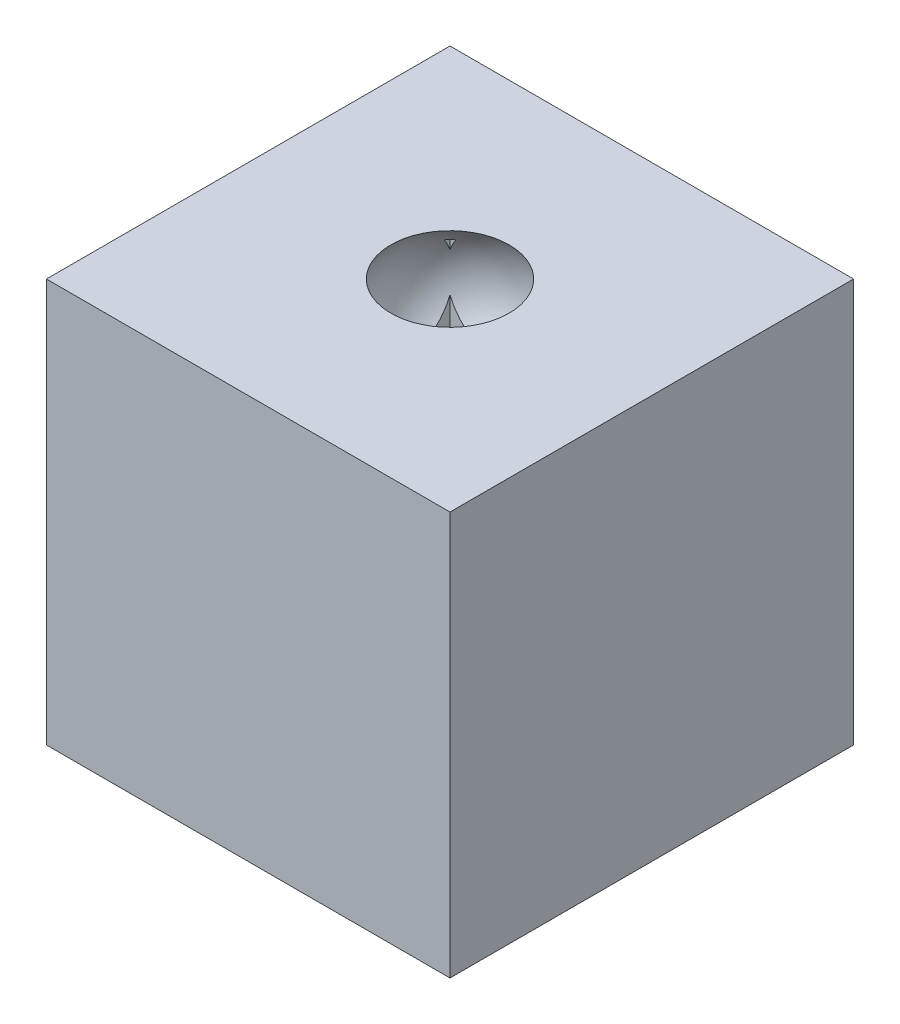
ISO-10303-21;
HEADER;
FILE_DESCRIPTION(('STEP AP214'),'2;1');
FILE_NAME('part.step','',(''),(''),'','','');
FILE_SCHEMA(('AUTOMOTIVE_DESIGN { 1 0 10303 214 1 1 1 1 }'));
ENDSEC;
DATA;
#1=APPLICATION_CONTEXT('core data for automotive mechanical design processes');
#2=APPLICATION_PROTOCOL_DEFINITION('international standard','automotive_design',2000,#1);
#3=PRODUCT_CONTEXT('',#1,'mechanical');
#4=PRODUCT('Part','Part','',(#3));
#5=PRODUCT_RELATED_PRODUCT_CATEGORY('part','',(#4));
#6=PRODUCT_DEFINITION_FORMATION('','',#4);
#7=PRODUCT_DEFINITION_CONTEXT('part definition',#1,'design');
#8=PRODUCT_DEFINITION('design','',#6,#7);
#9=PRODUCT_DEFINITION_SHAPE('','',#8);
#10=(LENGTH_UNIT() NAMED_UNIT(*) SI_UNIT(.MILLI.,.METRE.));
#11=(NAMED_UNIT(*) PLANE_ANGLE_UNIT() SI_UNIT($,.RADIAN.));
#12=(NAMED_UNIT(*) SI_UNIT($,.STERADIAN.) SOLID_ANGLE_UNIT());
#13=UNCERTAINTY_MEASURE_WITH_UNIT(LENGTH_MEASURE(1.E-05),#10,'distance_accuracy_value','');
#14=(GEOMETRIC_REPRESENTATION_CONTEXT(3) GLOBAL_UNCERTAINTY_ASSIGNED_CONTEXT((#13)) GLOBAL_UNIT_ASSIGNED_CONTEXT((#10,
#11,#12)) REPRESENTATION_CONTEXT('',''));
#15=CARTESIAN_POINT('',(0.,0.,0.));
#16=DIRECTION('',(0.,0.,1.));
#17=DIRECTION('',(1.,0.,0.));
#18=AXIS2_PLACEMENT_3D('',#15,#16,#17);
#19=CARTESIAN_POINT('',(0.,67.818,0.));
#20=DIRECTION('',(0.,-1.,0.));
#21=DIRECTION('',(-1.,0.,0.));
#22=AXIS2_PLACEMENT_3D('',#19,#20,#21);
#23=SPHERICAL_SURFACE('',#22,13.97);
#24=CARTESIAN_POINT('',(-9.525,67.818,0.));
#25=DIRECTION('',(1.,0.,0.));
#26=DIRECTION('',(0.,0.,-1.));
#27=AXIS2_PLACEMENT_3D('',#24,#25,#26);
#28=CIRCLE('',#27,10.2193578565387);
#29=CARTESIAN_POINT('',(-9.525,73.66,-8.38488586684399));
#30=VERTEX_POINT('',#29);
#31=CARTESIAN_POINT('',(-9.525,71.5206544532268,-9.525));
#32=VERTEX_POINT('',#31);
#33=EDGE_CURVE('E288',#30,#32,#28,.F.);
#34=ORIENTED_EDGE('',*,*,#33,.F.);
#35=CARTESIAN_POINT('',(0.,73.66,0.));
#36=DIRECTION('',(0.,-1.,0.));
#37=DIRECTION('',(0.,0.,-1.));
#38=AXIS2_PLACEMENT_3D('',#35,#36,#37);
#39=CIRCLE('',#38,12.6898359327455);
#40=CARTESIAN_POINT('',(-8.38488586684399,73.66,-9.525));
#41=VERTEX_POINT('',#40);
#42=EDGE_CURVE('E11',#41,#30,#39,.F.);
#43=ORIENTED_EDGE('',*,*,#42,.F.);
#44=CARTESIAN_POINT('',(0.,67.818,-9.525));
#45=DIRECTION('',(0.,0.,1.));
#46=DIRECTION('',(1.,0.,0.));
#47=AXIS2_PLACEMENT_3D('',#44,#45,#46);
#48=CIRCLE('',#47,10.2193578565387);
#49=EDGE_CURVE('E286',#32,#41,#48,.F.);
#50=ORIENTED_EDGE('',*,*,#49,.F.);
#51=EDGE_LOOP('',(#34,#43,#50));
#52=FACE_BOUND('',#51,.T.);
#53=CARTESIAN_POINT('',(0.,67.818,9.525));
#54=DIRECTION('',(0.,0.,-1.));
#55=DIRECTION('',(-1.,0.,0.));
#56=AXIS2_PLACEMENT_3D('',#53,#54,#55);
#57=CIRCLE('',#56,10.2193578565387);
#58=CARTESIAN_POINT('',(9.525,71.5206544532268,9.525));
#59=VERTEX_POINT('',#58);
#60=CARTESIAN_POINT('',(8.38488586684399,73.66,9.525));
#61=VERTEX_POINT('',#60);
#62=EDGE_CURVE('E292',#59,#61,#57,.F.);
#63=ORIENTED_EDGE('',*,*,#62,.F.);
#64=CARTESIAN_POINT('',(9.525,67.818,0.));
#65=DIRECTION('',(-1.,0.,0.));
#66=DIRECTION('',(0.,0.,1.));
#67=AXIS2_PLACEMENT_3D('',#64,#65,#66);
#68=CIRCLE('',#67,10.2193578565387);
#69=CARTESIAN_POINT('',(9.525,73.66,8.38488586684398));
#70=VERTEX_POINT('',#69);
#71=EDGE_CURVE('E279',#70,#59,#68,.F.);
#72=ORIENTED_EDGE('',*,*,#71,.F.);
#73=EDGE_CURVE('E466',#61,#70,#39,.F.);
#74=ORIENTED_EDGE('',*,*,#73,.F.);
#75=EDGE_LOOP('',(#63,#72,#74));
#76=FACE_BOUND('',#75,.T.);
#77=CARTESIAN_POINT('',(0.,76.2,0.));
#78=DIRECTION('',(0.,-1.,0.));
#79=DIRECTION('',(0.,0.,-1.));
#80=AXIS2_PLACEMENT_3D('',#77,#78,#79);
#81=CIRCLE('',#80,11.176);
#82=CARTESIAN_POINT('',(0.,76.2,-11.176));
#83=VERTEX_POINT('',#82);
#84=EDGE_CURVE('E412',#83,#83,#81,.T.);
#85=ORIENTED_EDGE('',*,*,#84,.F.);
#86=EDGE_LOOP('',(#85));
#87=FACE_BOUND('',#86,.T.);
#88=CARTESIAN_POINT('',(8.38488586684399,73.66,-9.525));
#89=VERTEX_POINT('',#88);
#90=CARTESIAN_POINT('',(9.525,71.5206544532268,-9.525));
#91=VERTEX_POINT('',#90);
#92=EDGE_CURVE('E284',#89,#91,#48,.F.);
#93=ORIENTED_EDGE('',*,*,#92,.F.);
#94=CARTESIAN_POINT('',(9.525,73.66,-8.38488586684399));
#95=VERTEX_POINT('',#94);
#96=EDGE_CURVE('E37',#95,#89,#39,.F.);
#97=ORIENTED_EDGE('',*,*,#96,.F.);
#98=EDGE_CURVE('E281',#91,#95,#68,.F.);
#99=ORIENTED_EDGE('',*,*,#98,.F.);
#100=EDGE_LOOP('',(#93,#97,#99));
#101=FACE_BOUND('',#100,.T.);
#102=CARTESIAN_POINT('',(-8.38488586684399,73.66,9.525));
#103=VERTEX_POINT('',#102);
#104=CARTESIAN_POINT('',(-9.525,71.5206544532268,9.525));
#105=VERTEX_POINT('',#104);
#106=EDGE_CURVE('E263',#103,#105,#57,.F.);
#107=ORIENTED_EDGE('',*,*,#106,.F.);
#108=CARTESIAN_POINT('',(-9.525,73.66,8.38488586684399));
#109=VERTEX_POINT('',#108);
#110=EDGE_CURVE('E42',#109,#103,#39,.F.);
#111=ORIENTED_EDGE('',*,*,#110,.F.);
#112=EDGE_CURVE('E258',#105,#109,#28,.F.);
#113=ORIENTED_EDGE('',*,*,#112,.F.);
#114=EDGE_LOOP('',(#107,#111,#113));
#115=FACE_BOUND('',#114,.T.);
#116=CARTESIAN_POINT('',(-9.525,64.1153455467733,9.525));
#117=VERTEX_POINT('',#116);
#118=CARTESIAN_POINT('',(9.525,64.1153455467733,9.525));
#119=VERTEX_POINT('',#118);
#120=EDGE_CURVE('E293',#117,#119,#57,.F.);
#121=ORIENTED_EDGE('',*,*,#120,.F.);
#122=CARTESIAN_POINT('',(-9.525,64.1153455467733,-9.525));
#123=VERTEX_POINT('',#122);
#124=EDGE_CURVE('E290',#123,#117,#28,.F.);
#125=ORIENTED_EDGE('',*,*,#124,.F.);
#126=CARTESIAN_POINT('',(9.525,64.1153455467733,-9.525));
#127=VERTEX_POINT('',#126);
#128=EDGE_CURVE('E287',#127,#123,#48,.F.);
#129=ORIENTED_EDGE('',*,*,#128,.F.);
#130=EDGE_CURVE('E283',#119,#127,#68,.F.);
#131=ORIENTED_EDGE('',*,*,#130,.F.);
#132=EDGE_LOOP('',(#121,#125,#129,#131));
#133=FACE_BOUND('',#132,.T.);
#134=ADVANCED_FACE('F33',(#52,#76,#87,#101,#115,#133),#23,.F.);
#135=CARTESIAN_POINT('',(0.,67.818,0.));
#136=DIRECTION('',(0.,-1.,0.));
#137=DIRECTION('',(-1.,0.,0.));
#138=AXIS2_PLACEMENT_3D('',#135,#136,#137);
#139=SPHERICAL_SURFACE('',#138,16.51);
#140=CARTESIAN_POINT('',(0.,73.66,0.));
#141=DIRECTION('',(0.,-1.,0.));
#142=DIRECTION('',(0.,0.,-1.));
#143=AXIS2_PLACEMENT_3D('',#140,#141,#142);
#144=CIRCLE('',#143,15.4418631000278);
#145=CARTESIAN_POINT('',(0.,73.66,-15.4418631000278));
#146=VERTEX_POINT('',#145);
#147=EDGE_CURVE('E319',#146,#146,#144,.T.);
#148=ORIENTED_EDGE('',*,*,#147,.T.);
#149=EDGE_LOOP('',(#148));
#150=FACE_BOUND('',#149,.T.);
#151=CARTESIAN_POINT('',(-9.525,67.818,0.));
#152=DIRECTION('',(1.,0.,0.));
#153=DIRECTION('',(0.,0.,-1.));
#154=AXIS2_PLACEMENT_3D('',#151,#152,#153);
#155=CIRCLE('',#154,13.485342969313);
#156=CARTESIAN_POINT('',(-9.525,58.2718567997332,-9.525));
#157=VERTEX_POINT('',#156);
#158=CARTESIAN_POINT('',(-9.525,58.2718567997332,9.525));
#159=VERTEX_POINT('',#158);
#160=EDGE_CURVE('E461',#157,#159,#155,.F.);
#161=ORIENTED_EDGE('',*,*,#160,.T.);
#162=CARTESIAN_POINT('',(0.,67.818,9.525));
#163=DIRECTION('',(0.,0.,-1.));
#164=DIRECTION('',(-1.,0.,0.));
#165=AXIS2_PLACEMENT_3D('',#162,#163,#164);
#166=CIRCLE('',#165,13.485342969313);
#167=CARTESIAN_POINT('',(9.525,58.2718567997332,9.525));
#168=VERTEX_POINT('',#167);
#169=EDGE_CURVE('E463',#159,#168,#166,.F.);
#170=ORIENTED_EDGE('',*,*,#169,.T.);
#171=CARTESIAN_POINT('',(9.525,67.818,0.));
#172=DIRECTION('',(-1.,0.,0.));
#173=DIRECTION('',(0.,0.,1.));
#174=AXIS2_PLACEMENT_3D('',#171,#172,#173);
#175=CIRCLE('',#174,13.485342969313);
#176=CARTESIAN_POINT('',(9.525,58.2718567997332,-9.525));
#177=VERTEX_POINT('',#176);
#178=EDGE_CURVE('E455',#168,#177,#175,.F.);
#179=ORIENTED_EDGE('',*,*,#178,.T.);
#180=CARTESIAN_POINT('',(0.,67.818,-9.525));
#181=DIRECTION('',(0.,0.,1.));
#182=DIRECTION('',(1.,0.,0.));
#183=AXIS2_PLACEMENT_3D('',#180,#181,#182);
#184=CIRCLE('',#183,13.485342969313);
#185=EDGE_CURVE('E458',#177,#157,#184,.F.);
#186=ORIENTED_EDGE('',*,*,#185,.T.);
#187=EDGE_LOOP('',(#161,#170,#179,#186));
#188=FACE_BOUND('',#187,.T.);
#189=ADVANCED_FACE('F524',(#150,#188),#139,.T.);
#190=CARTESIAN_POINT('',(0.,0.,0.));
#191=DIRECTION('',(0.,-1.,0.));
#192=DIRECTION('',(0.,0.,-1.));
#193=AXIS2_PLACEMENT_3D('',#190,#191,#192);
#194=PLANE('',#193);
#195=DIRECTION('',(0.,0.,-1.));
#196=VECTOR('',#195,1.);
#197=CARTESIAN_POINT('',(38.1,0.,38.1));
#198=LINE('',#197,#196);
#199=CARTESIAN_POINT('',(38.1,0.,38.1));
#200=VERTEX_POINT('',#199);
#201=CARTESIAN_POINT('',(38.1,0.,-38.1));
#202=VERTEX_POINT('',#201);
#203=EDGE_CURVE('E424',#200,#202,#198,.T.);
#204=ORIENTED_EDGE('',*,*,#203,.F.);
#205=DIRECTION('',(1.,0.,0.));
#206=VECTOR('',#205,1.);
#207=CARTESIAN_POINT('',(-38.1,0.,38.1));
#208=LINE('',#207,#206);
#209=CARTESIAN_POINT('',(-38.1,0.,38.1));
#210=VERTEX_POINT('',#209);
#211=EDGE_CURVE('E417',#210,#200,#208,.T.);
#212=ORIENTED_EDGE('',*,*,#211,.F.);
#213=DIRECTION('',(0.,0.,1.));
#214=VECTOR('',#213,1.);
#215=CARTESIAN_POINT('',(-38.1,0.,38.1));
#216=LINE('',#215,#214);
#217=CARTESIAN_POINT('',(-38.1,0.,-38.1));
#218=VERTEX_POINT('',#217);
#219=EDGE_CURVE('E429',#218,#210,#216,.T.);
#220=ORIENTED_EDGE('',*,*,#219,.F.);
#221=DIRECTION('',(-1.,0.,0.));
#222=VECTOR('',#221,1.);
#223=CARTESIAN_POINT('',(-38.1,0.,-38.1));
#224=LINE('',#223,#222);
#225=EDGE_CURVE('E427',#202,#218,#224,.T.);
#226=ORIENTED_EDGE('',*,*,#225,.F.);
#227=EDGE_LOOP('',(#204,#212,#220,#226));
#228=FACE_BOUND('',#227,.T.);
#229=DIRECTION('',(0.,0.,1.));
#230=VECTOR('',#229,1.);
#231=CARTESIAN_POINT('',(25.4,0.,-16.51));
#232=LINE('',#231,#230);
#233=CARTESIAN_POINT('',(25.4,0.,1.905));
#234=VERTEX_POINT('',#233);
#235=CARTESIAN_POINT('',(25.4,0.,16.51));
#236=VERTEX_POINT('',#235);
#237=EDGE_CURVE('E339',#234,#236,#232,.T.);
#238=ORIENTED_EDGE('',*,*,#237,.F.);
#239=CARTESIAN_POINT('',(25.4,0.,0.));
#240=DIRECTION('',(0.,-1.,0.));
#241=DIRECTION('',(0.,0.,-1.));
#242=AXIS2_PLACEMENT_3D('',#239,#240,#241);
#243=CIRCLE('',#242,1.905);
#244=CARTESIAN_POINT('',(25.4,0.,-1.905));
#245=VERTEX_POINT('',#244);
#246=EDGE_CURVE('E306',#245,#234,#243,.T.);
#247=ORIENTED_EDGE('',*,*,#246,.F.);
#248=CARTESIAN_POINT('',(25.4,0.,-16.51));
#249=VERTEX_POINT('',#248);
#250=EDGE_CURVE('E390',#249,#245,#232,.T.);
#251=ORIENTED_EDGE('',*,*,#250,.F.);
#252=DIRECTION('',(1.,0.,0.));
#253=VECTOR('',#252,1.);
#254=CARTESIAN_POINT('',(-25.4,0.,-16.51));
#255=LINE('',#254,#253);
#256=CARTESIAN_POINT('',(-25.4,0.,-16.51));
#257=VERTEX_POINT('',#256);
#258=EDGE_CURVE('E399',#257,#249,#255,.T.);
#259=ORIENTED_EDGE('',*,*,#258,.F.);
#260=DIRECTION('',(0.,0.,-1.));
#261=VECTOR('',#260,1.);
#262=CARTESIAN_POINT('',(-25.4,0.,-16.51));
#263=LINE('',#262,#261);
#264=CARTESIAN_POINT('',(-25.4,0.,-1.905));
#265=VERTEX_POINT('',#264);
#266=EDGE_CURVE('E395',#265,#257,#263,.T.);
#267=ORIENTED_EDGE('',*,*,#266,.F.);
#268=CARTESIAN_POINT('',(-25.4,0.,0.));
#269=DIRECTION('',(0.,-1.,0.));
#270=DIRECTION('',(0.,0.,-1.));
#271=AXIS2_PLACEMENT_3D('',#268,#269,#270);
#272=CIRCLE('',#271,1.905);
#273=CARTESIAN_POINT('',(-25.4,0.,1.905));
#274=VERTEX_POINT('',#273);
#275=EDGE_CURVE('E310',#274,#265,#272,.T.);
#276=ORIENTED_EDGE('',*,*,#275,.F.);
#277=CARTESIAN_POINT('',(-25.4,0.,16.51));
#278=VERTEX_POINT('',#277);
#279=EDGE_CURVE('E396',#278,#274,#263,.T.);
#280=ORIENTED_EDGE('',*,*,#279,.F.);
#281=DIRECTION('',(-1.,0.,0.));
#282=VECTOR('',#281,1.);
#283=CARTESIAN_POINT('',(-25.4,0.,16.51));
#284=LINE('',#283,#282);
#285=EDGE_CURVE('E393',#236,#278,#284,.T.);
#286=ORIENTED_EDGE('',*,*,#285,.F.);
#287=EDGE_LOOP('',(#238,#247,#251,#259,#267,#276,#280,#286));
#288=FACE_BOUND('',#287,.T.);
#289=ADVANCED_FACE('F530',(#228,#288),#194,.T.);
#290=CARTESIAN_POINT('',(25.4,-2.54,-16.51));
#291=DIRECTION('',(-1.,0.,0.));
#292=DIRECTION('',(0.,0.,1.));
#293=AXIS2_PLACEMENT_3D('',#290,#291,#292);
#294=PLANE('',#293);
#295=DIRECTION('',(0.,1.,0.));
#296=VECTOR('',#295,1.);
#297=CARTESIAN_POINT('',(25.4,-7.92815367264149,1.905));
#298=LINE('',#297,#296);
#299=CARTESIAN_POINT('',(25.4,-2.54,1.905));
#300=VERTEX_POINT('',#299);
#301=EDGE_CURVE('E452',#234,#300,#298,.F.);
#302=ORIENTED_EDGE('',*,*,#301,.F.);
#303=ORIENTED_EDGE('',*,*,#237,.T.);
#304=DIRECTION('',(0.,1.,0.));
#305=VECTOR('',#304,1.);
#306=CARTESIAN_POINT('',(25.4,-2.54,16.51));
#307=LINE('',#306,#305);
#308=CARTESIAN_POINT('',(25.4,-2.54,16.51));
#309=VERTEX_POINT('',#308);
#310=EDGE_CURVE('E409',#309,#236,#307,.T.);
#311=ORIENTED_EDGE('',*,*,#310,.F.);
#312=DIRECTION('',(0.,0.,1.));
#313=VECTOR('',#312,1.);
#314=CARTESIAN_POINT('',(25.4,-2.54,-16.51));
#315=LINE('',#314,#313);
#316=EDGE_CURVE('E381',#300,#309,#315,.T.);
#317=ORIENTED_EDGE('',*,*,#316,.F.);
#318=EDGE_LOOP('',(#302,#303,#311,#317));
#319=FACE_BOUND('',#318,.T.);
#320=ADVANCED_FACE('F536',(#319),#294,.F.);
#321=DIRECTION('',(0.,1.,0.));
#322=VECTOR('',#321,1.);
#323=CARTESIAN_POINT('',(25.4,-7.92815367264149,-1.905));
#324=LINE('',#323,#322);
#325=CARTESIAN_POINT('',(25.4,-2.54,-1.905));
#326=VERTEX_POINT('',#325);
#327=EDGE_CURVE('E450',#326,#245,#324,.T.);
#328=ORIENTED_EDGE('',*,*,#327,.F.);
#329=CARTESIAN_POINT('',(25.4,-2.54,-16.51));
#330=VERTEX_POINT('',#329);
#331=EDGE_CURVE('E377',#330,#326,#315,.T.);
#332=ORIENTED_EDGE('',*,*,#331,.F.);
#333=DIRECTION('',(0.,1.,0.));
#334=VECTOR('',#333,1.);
#335=CARTESIAN_POINT('',(25.4,-2.54,-16.51));
#336=LINE('',#335,#334);
#337=EDGE_CURVE('E389',#330,#249,#336,.T.);
#338=ORIENTED_EDGE('',*,*,#337,.T.);
#339=ORIENTED_EDGE('',*,*,#250,.T.);
#340=EDGE_LOOP('',(#328,#332,#338,#339));
#341=FACE_BOUND('',#340,.T.);
#342=ADVANCED_FACE('F593',(#341),#294,.F.);
#343=CARTESIAN_POINT('',(-25.4,-2.54,-16.51));
#344=DIRECTION('',(1.,0.,0.));
#345=DIRECTION('',(0.,0.,-1.));
#346=AXIS2_PLACEMENT_3D('',#343,#344,#345);
#347=PLANE('',#346);
#348=DIRECTION('',(0.,1.,0.));
#349=VECTOR('',#348,1.);
#350=CARTESIAN_POINT('',(-25.4,-7.92815367264149,-1.905));
#351=LINE('',#350,#349);
#352=CARTESIAN_POINT('',(-25.4,-2.54,-1.905));
#353=VERTEX_POINT('',#352);
#354=EDGE_CURVE('E447',#265,#353,#351,.F.);
#355=ORIENTED_EDGE('',*,*,#354,.F.);
#356=ORIENTED_EDGE('',*,*,#266,.T.);
#357=DIRECTION('',(0.,1.,0.));
#358=VECTOR('',#357,1.);
#359=CARTESIAN_POINT('',(-25.4,-2.54,-16.51));
#360=LINE('',#359,#358);
#361=CARTESIAN_POINT('',(-25.4,-2.54,-16.51));
#362=VERTEX_POINT('',#361);
#363=EDGE_CURVE('E403',#362,#257,#360,.T.);
#364=ORIENTED_EDGE('',*,*,#363,.F.);
#365=DIRECTION('',(0.,0.,-1.));
#366=VECTOR('',#365,1.);
#367=CARTESIAN_POINT('',(-25.4,-2.54,-16.51));
#368=LINE('',#367,#366);
#369=EDGE_CURVE('E383',#353,#362,#368,.T.);
#370=ORIENTED_EDGE('',*,*,#369,.F.);
#371=EDGE_LOOP('',(#355,#356,#364,#370));
#372=FACE_BOUND('',#371,.T.);
#373=ADVANCED_FACE('F605',(#372),#347,.F.);
#374=DIRECTION('',(0.,1.,0.));
#375=VECTOR('',#374,1.);
#376=CARTESIAN_POINT('',(-25.4,-7.92815367264149,1.905));
#377=LINE('',#376,#375);
#378=CARTESIAN_POINT('',(-25.4,-2.54,1.905));
#379=VERTEX_POINT('',#378);
#380=EDGE_CURVE('E443',#379,#274,#377,.T.);
#381=ORIENTED_EDGE('',*,*,#380,.F.);
#382=CARTESIAN_POINT('',(-25.4,-2.54,16.51));
#383=VERTEX_POINT('',#382);
#384=EDGE_CURVE('E384',#383,#379,#368,.T.);
#385=ORIENTED_EDGE('',*,*,#384,.F.);
#386=DIRECTION('',(0.,1.,0.));
#387=VECTOR('',#386,1.);
#388=CARTESIAN_POINT('',(-25.4,-2.54,16.51));
#389=LINE('',#388,#387);
#390=EDGE_CURVE('E406',#383,#278,#389,.T.);
#391=ORIENTED_EDGE('',*,*,#390,.T.);
#392=ORIENTED_EDGE('',*,*,#279,.T.);
#393=EDGE_LOOP('',(#381,#385,#391,#392));
#394=FACE_BOUND('',#393,.T.);
#395=ADVANCED_FACE('F610',(#394),#347,.F.);
#396=CARTESIAN_POINT('',(0.,-2.54,0.));
#397=DIRECTION('',(0.,1.,0.));
#398=DIRECTION('',(0.,0.,1.));
#399=AXIS2_PLACEMENT_3D('',#396,#397,#398);
#400=PLANE('',#399);
#401=CARTESIAN_POINT('',(25.4,-2.54,0.));
#402=DIRECTION('',(0.,1.,0.));
#403=DIRECTION('',(0.,0.,1.));
#404=AXIS2_PLACEMENT_3D('',#401,#402,#403);
#405=CIRCLE('',#404,1.905);
#406=EDGE_CURVE('E308',#300,#326,#405,.T.);
#407=ORIENTED_EDGE('',*,*,#406,.F.);
#408=ORIENTED_EDGE('',*,*,#316,.T.);
#409=DIRECTION('',(-1.,0.,0.));
#410=VECTOR('',#409,1.);
#411=CARTESIAN_POINT('',(-25.4,-2.54,16.51));
#412=LINE('',#411,#410);
#413=EDGE_CURVE('E380',#309,#383,#412,.T.);
#414=ORIENTED_EDGE('',*,*,#413,.T.);
#415=ORIENTED_EDGE('',*,*,#384,.T.);
#416=CARTESIAN_POINT('',(-25.4,-2.54,0.));
#417=DIRECTION('',(0.,1.,0.));
#418=DIRECTION('',(0.,0.,1.));
#419=AXIS2_PLACEMENT_3D('',#416,#417,#418);
#420=CIRCLE('',#419,1.905);
#421=EDGE_CURVE('E312',#353,#379,#420,.T.);
#422=ORIENTED_EDGE('',*,*,#421,.F.);
#423=ORIENTED_EDGE('',*,*,#369,.T.);
#424=DIRECTION('',(1.,0.,0.));
#425=VECTOR('',#424,1.);
#426=CARTESIAN_POINT('',(-25.4,-2.54,-16.51));
#427=LINE('',#426,#425);
#428=EDGE_CURVE('E387',#362,#330,#427,.T.);
#429=ORIENTED_EDGE('',*,*,#428,.T.);
#430=ORIENTED_EDGE('',*,*,#331,.T.);
#431=EDGE_LOOP('',(#407,#408,#414,#415,#422,#423,#429,#430));
#432=FACE_BOUND('',#431,.T.);
#433=DIRECTION('',(0.,0.,1.));
#434=VECTOR('',#433,1.);
#435=CARTESIAN_POINT('',(22.86,-2.54,0.));
#436=LINE('',#435,#434);
#437=CARTESIAN_POINT('',(22.86,-2.54,-13.97));
#438=VERTEX_POINT('',#437);
#439=CARTESIAN_POINT('',(22.86,-2.54,13.97));
#440=VERTEX_POINT('',#439);
#441=EDGE_CURVE('E333',#438,#440,#436,.T.);
#442=ORIENTED_EDGE('',*,*,#441,.F.);
#443=DIRECTION('',(1.,0.,0.));
#444=VECTOR('',#443,1.);
#445=CARTESIAN_POINT('',(0.,-2.54,-13.97));
#446=LINE('',#445,#444);
#447=CARTESIAN_POINT('',(-22.86,-2.54,-13.97));
#448=VERTEX_POINT('',#447);
#449=EDGE_CURVE('E366',#448,#438,#446,.T.);
#450=ORIENTED_EDGE('',*,*,#449,.F.);
#451=DIRECTION('',(0.,0.,-1.));
#452=VECTOR('',#451,1.);
#453=CARTESIAN_POINT('',(-22.86,-2.54,0.));
#454=LINE('',#453,#452);
#455=CARTESIAN_POINT('',(-22.86,-2.54,13.97));
#456=VERTEX_POINT('',#455);
#457=EDGE_CURVE('E373',#456,#448,#454,.T.);
#458=ORIENTED_EDGE('',*,*,#457,.F.);
#459=DIRECTION('',(-1.,0.,0.));
#460=VECTOR('',#459,1.);
#461=CARTESIAN_POINT('',(0.,-2.54,13.97));
#462=LINE('',#461,#460);
#463=EDGE_CURVE('E371',#440,#456,#462,.T.);
#464=ORIENTED_EDGE('',*,*,#463,.F.);
#465=EDGE_LOOP('',(#442,#450,#458,#464));
#466=FACE_BOUND('',#465,.T.);
#467=ADVANCED_FACE('F559',(#432,#466),#400,.F.);
#468=CARTESIAN_POINT('',(38.1,76.2,38.1));
#469=DIRECTION('',(-1.,0.,0.));
#470=DIRECTION('',(0.,0.,1.));
#471=AXIS2_PLACEMENT_3D('',#468,#469,#470);
#472=PLANE('',#471);
#473=ORIENTED_EDGE('',*,*,#203,.T.);
#474=DIRECTION('',(0.,-1.,0.));
#475=VECTOR('',#474,1.);
#476=CARTESIAN_POINT('',(38.1,76.2,-38.1));
#477=LINE('',#476,#475);
#478=CARTESIAN_POINT('',(38.1,76.2,-38.1));
#479=VERTEX_POINT('',#478);
#480=EDGE_CURVE('E440',#479,#202,#477,.T.);
#481=ORIENTED_EDGE('',*,*,#480,.F.);
#482=DIRECTION('',(0.,0.,-1.));
#483=VECTOR('',#482,1.);
#484=CARTESIAN_POINT('',(38.1,76.2,38.1));
#485=LINE('',#484,#483);
#486=CARTESIAN_POINT('',(38.1,76.2,38.1));
#487=VERTEX_POINT('',#486);
#488=EDGE_CURVE('E413',#487,#479,#485,.T.);
#489=ORIENTED_EDGE('',*,*,#488,.F.);
#490=DIRECTION('',(0.,-1.,0.));
#491=VECTOR('',#490,1.);
#492=CARTESIAN_POINT('',(38.1,76.2,38.1));
#493=LINE('',#492,#491);
#494=EDGE_CURVE('E423',#487,#200,#493,.T.);
#495=ORIENTED_EDGE('',*,*,#494,.T.);
#496=EDGE_LOOP('',(#473,#481,#489,#495));
#497=FACE_BOUND('',#496,.T.);
#498=ADVANCED_FACE('F35',(#497),#472,.F.);
#499=CARTESIAN_POINT('',(-38.1,76.2,-38.1));
#500=DIRECTION('',(0.,0.,1.));
#501=DIRECTION('',(1.,0.,0.));
#502=AXIS2_PLACEMENT_3D('',#499,#500,#501);
#503=PLANE('',#502);
#504=ORIENTED_EDGE('',*,*,#225,.T.);
#505=DIRECTION('',(0.,-1.,0.));
#506=VECTOR('',#505,1.);
#507=CARTESIAN_POINT('',(-38.1,76.2,-38.1));
#508=LINE('',#507,#506);
#509=CARTESIAN_POINT('',(-38.1,76.2,-38.1));
#510=VERTEX_POINT('',#509);
#511=EDGE_CURVE('E437',#510,#218,#508,.T.);
#512=ORIENTED_EDGE('',*,*,#511,.F.);
#513=DIRECTION('',(-1.,0.,0.));
#514=VECTOR('',#513,1.);
#515=CARTESIAN_POINT('',(-38.1,76.2,-38.1));
#516=LINE('',#515,#514);
#517=EDGE_CURVE('E416',#479,#510,#516,.T.);
#518=ORIENTED_EDGE('',*,*,#517,.F.);
#519=ORIENTED_EDGE('',*,*,#480,.T.);
#520=EDGE_LOOP('',(#504,#512,#518,#519));
#521=FACE_BOUND('',#520,.T.);
#522=ADVANCED_FACE('F552',(#521),#503,.F.);
#523=CARTESIAN_POINT('',(-38.1,76.2,38.1));
#524=DIRECTION('',(1.,0.,0.));
#525=DIRECTION('',(0.,0.,-1.));
#526=AXIS2_PLACEMENT_3D('',#523,#524,#525);
#527=PLANE('',#526);
#528=ORIENTED_EDGE('',*,*,#219,.T.);
#529=DIRECTION('',(0.,-1.,0.));
#530=VECTOR('',#529,1.);
#531=CARTESIAN_POINT('',(-38.1,76.2,38.1));
#532=LINE('',#531,#530);
#533=CARTESIAN_POINT('',(-38.1,76.2,38.1));
#534=VERTEX_POINT('',#533);
#535=EDGE_CURVE('E434',#534,#210,#532,.T.);
#536=ORIENTED_EDGE('',*,*,#535,.F.);
#537=DIRECTION('',(0.,0.,1.));
#538=VECTOR('',#537,1.);
#539=CARTESIAN_POINT('',(-38.1,76.2,38.1));
#540=LINE('',#539,#538);
#541=EDGE_CURVE('E419',#510,#534,#540,.T.);
#542=ORIENTED_EDGE('',*,*,#541,.F.);
#543=ORIENTED_EDGE('',*,*,#511,.T.);
#544=EDGE_LOOP('',(#528,#536,#542,#543));
#545=FACE_BOUND('',#544,.T.);
#546=ADVANCED_FACE('F549',(#545),#527,.F.);
#547=CARTESIAN_POINT('',(-38.1,76.2,38.1));
#548=DIRECTION('',(0.,0.,-1.));
#549=DIRECTION('',(-1.,0.,0.));
#550=AXIS2_PLACEMENT_3D('',#547,#548,#549);
#551=PLANE('',#550);
#552=ORIENTED_EDGE('',*,*,#211,.T.);
#553=ORIENTED_EDGE('',*,*,#494,.F.);
#554=DIRECTION('',(1.,0.,0.));
#555=VECTOR('',#554,1.);
#556=CARTESIAN_POINT('',(-38.1,76.2,38.1));
#557=LINE('',#556,#555);
#558=EDGE_CURVE('E421',#534,#487,#557,.T.);
#559=ORIENTED_EDGE('',*,*,#558,.F.);
#560=ORIENTED_EDGE('',*,*,#535,.T.);
#561=EDGE_LOOP('',(#552,#553,#559,#560));
#562=FACE_BOUND('',#561,.T.);
#563=ADVANCED_FACE('F542',(#562),#551,.F.);
#564=CARTESIAN_POINT('',(0.,76.2,0.));
#565=DIRECTION('',(0.,-1.,0.));
#566=DIRECTION('',(0.,0.,-1.));
#567=AXIS2_PLACEMENT_3D('',#564,#565,#566);
#568=PLANE('',#567);
#569=ORIENTED_EDGE('',*,*,#84,.T.);
#570=EDGE_LOOP('',(#569));
#571=FACE_BOUND('',#570,.T.);
#572=ORIENTED_EDGE('',*,*,#488,.T.);
#573=ORIENTED_EDGE('',*,*,#517,.T.);
#574=ORIENTED_EDGE('',*,*,#541,.T.);
#575=ORIENTED_EDGE('',*,*,#558,.T.);
#576=EDGE_LOOP('',(#572,#573,#574,#575));
#577=FACE_BOUND('',#576,.T.);
#578=ADVANCED_FACE('F538',(#571,#577),#568,.F.);
#579=CARTESIAN_POINT('',(-25.4,-2.54,16.51));
#580=DIRECTION('',(0.,0.,-1.));
#581=DIRECTION('',(-1.,0.,0.));
#582=AXIS2_PLACEMENT_3D('',#579,#580,#581);
#583=PLANE('',#582);
#584=ORIENTED_EDGE('',*,*,#285,.T.);
#585=ORIENTED_EDGE('',*,*,#390,.F.);
#586=ORIENTED_EDGE('',*,*,#413,.F.);
#587=ORIENTED_EDGE('',*,*,#310,.T.);
#588=EDGE_LOOP('',(#584,#585,#586,#587));
#589=FACE_BOUND('',#588,.T.);
#590=ADVANCED_FACE('F541',(#589),#583,.F.);
#591=CARTESIAN_POINT('',(-25.4,-2.54,-16.51));
#592=DIRECTION('',(0.,0.,1.));
#593=DIRECTION('',(1.,0.,0.));
#594=AXIS2_PLACEMENT_3D('',#591,#592,#593);
#595=PLANE('',#594);
#596=ORIENTED_EDGE('',*,*,#258,.T.);
#597=ORIENTED_EDGE('',*,*,#337,.F.);
#598=ORIENTED_EDGE('',*,*,#428,.F.);
#599=ORIENTED_EDGE('',*,*,#363,.T.);
#600=EDGE_LOOP('',(#596,#597,#598,#599));
#601=FACE_BOUND('',#600,.T.);
#602=ADVANCED_FACE('F599',(#601),#595,.F.);
#603=CARTESIAN_POINT('',(0.,2.54,0.));
#604=DIRECTION('',(0.,-1.,0.));
#605=DIRECTION('',(0.,0.,-1.));
#606=AXIS2_PLACEMENT_3D('',#603,#604,#605);
#607=PLANE('',#606);
#608=CARTESIAN_POINT('',(-25.4,2.54,0.));
#609=DIRECTION('',(0.,-1.,0.));
#610=DIRECTION('',(0.,0.,-1.));
#611=AXIS2_PLACEMENT_3D('',#608,#609,#610);
#612=CIRCLE('',#611,1.13029999999998);
#613=CARTESIAN_POINT('',(-25.4,2.54,-1.13029999999998));
#614=VERTEX_POINT('',#613);
#615=EDGE_CURVE('E297',#614,#614,#612,.T.);
#616=ORIENTED_EDGE('',*,*,#615,.T.);
#617=EDGE_LOOP('',(#616));
#618=FACE_BOUND('',#617,.T.);
#619=CARTESIAN_POINT('',(25.4,2.54,0.));
#620=DIRECTION('',(0.,-1.,0.));
#621=DIRECTION('',(0.,0.,-1.));
#622=AXIS2_PLACEMENT_3D('',#619,#620,#621);
#623=CIRCLE('',#622,1.13029999999999);
#624=CARTESIAN_POINT('',(25.4,2.54,-1.13029999999999));
#625=VERTEX_POINT('',#624);
#626=EDGE_CURVE('E303',#625,#625,#623,.T.);
#627=ORIENTED_EDGE('',*,*,#626,.T.);
#628=EDGE_LOOP('',(#627));
#629=FACE_BOUND('',#628,.T.);
#630=DIRECTION('',(0.,0.,-1.));
#631=VECTOR('',#630,1.);
#632=CARTESIAN_POINT('',(35.56,2.54,0.));
#633=LINE('',#632,#631);
#634=CARTESIAN_POINT('',(35.56,2.54,35.56));
#635=VERTEX_POINT('',#634);
#636=CARTESIAN_POINT('',(35.56,2.54,-35.56));
#637=VERTEX_POINT('',#636);
#638=EDGE_CURVE('E315',#635,#637,#633,.T.);
#639=ORIENTED_EDGE('',*,*,#638,.T.);
#640=DIRECTION('',(-1.,0.,0.));
#641=VECTOR('',#640,1.);
#642=CARTESIAN_POINT('',(0.,2.54,-35.56));
#643=LINE('',#642,#641);
#644=CARTESIAN_POINT('',(-35.56,2.54,-35.56));
#645=VERTEX_POINT('',#644);
#646=EDGE_CURVE('E318',#637,#645,#643,.T.);
#647=ORIENTED_EDGE('',*,*,#646,.T.);
#648=DIRECTION('',(0.,0.,1.));
#649=VECTOR('',#648,1.);
#650=CARTESIAN_POINT('',(-35.56,2.54,0.));
#651=LINE('',#650,#649);
#652=CARTESIAN_POINT('',(-35.56,2.54,35.56));
#653=VERTEX_POINT('',#652);
#654=EDGE_CURVE('E323',#645,#653,#651,.T.);
#655=ORIENTED_EDGE('',*,*,#654,.T.);
#656=DIRECTION('',(1.,0.,0.));
#657=VECTOR('',#656,1.);
#658=CARTESIAN_POINT('',(0.,2.54,35.56));
#659=LINE('',#658,#657);
#660=EDGE_CURVE('E320',#653,#635,#659,.T.);
#661=ORIENTED_EDGE('',*,*,#660,.T.);
#662=EDGE_LOOP('',(#639,#647,#655,#661));
#663=FACE_BOUND('',#662,.T.);
#664=DIRECTION('',(-1.,0.,0.));
#665=VECTOR('',#664,1.);
#666=CARTESIAN_POINT('',(-25.4,2.54,13.97));
#667=LINE('',#666,#665);
#668=CARTESIAN_POINT('',(22.86,2.54,13.97));
#669=VERTEX_POINT('',#668);
#670=CARTESIAN_POINT('',(-22.86,2.54,13.97));
#671=VERTEX_POINT('',#670);
#672=EDGE_CURVE('E326',#669,#671,#667,.T.);
#673=ORIENTED_EDGE('',*,*,#672,.T.);
#674=DIRECTION('',(0.,0.,-1.));
#675=VECTOR('',#674,1.);
#676=CARTESIAN_POINT('',(-22.86,2.54,-16.51));
#677=LINE('',#676,#675);
#678=CARTESIAN_POINT('',(-22.86,2.54,-13.97));
#679=VERTEX_POINT('',#678);
#680=EDGE_CURVE('E328',#671,#679,#677,.T.);
#681=ORIENTED_EDGE('',*,*,#680,.T.);
#682=DIRECTION('',(1.,0.,0.));
#683=VECTOR('',#682,1.);
#684=CARTESIAN_POINT('',(-25.4,2.54,-13.97));
#685=LINE('',#684,#683);
#686=CARTESIAN_POINT('',(22.86,2.54,-13.97));
#687=VERTEX_POINT('',#686);
#688=EDGE_CURVE('E331',#679,#687,#685,.T.);
#689=ORIENTED_EDGE('',*,*,#688,.T.);
#690=DIRECTION('',(0.,0.,1.));
#691=VECTOR('',#690,1.);
#692=CARTESIAN_POINT('',(22.86,2.54,-16.51));
#693=LINE('',#692,#691);
#694=EDGE_CURVE('E314',#687,#669,#693,.T.);
#695=ORIENTED_EDGE('',*,*,#694,.T.);
#696=EDGE_LOOP('',(#673,#681,#689,#695));
#697=FACE_BOUND('',#696,.T.);
#698=ADVANCED_FACE('F623',(#618,#629,#663,#697),#607,.F.);
#699=CARTESIAN_POINT('',(35.56,76.2,38.1));
#700=DIRECTION('',(-1.,0.,0.));
#701=DIRECTION('',(0.,0.,1.));
#702=AXIS2_PLACEMENT_3D('',#699,#700,#701);
#703=PLANE('',#702);
#704=ORIENTED_EDGE('',*,*,#638,.F.);
#705=DIRECTION('',(0.,-1.,0.));
#706=VECTOR('',#705,1.);
#707=CARTESIAN_POINT('',(35.56,76.2,35.56));
#708=LINE('',#707,#706);
#709=CARTESIAN_POINT('',(35.56,73.66,35.56));
#710=VERTEX_POINT('',#709);
#711=EDGE_CURVE('E344',#710,#635,#708,.T.);
#712=ORIENTED_EDGE('',*,*,#711,.F.);
#713=DIRECTION('',(0.,0.,-1.));
#714=VECTOR('',#713,1.);
#715=CARTESIAN_POINT('',(35.56,73.66,0.));
#716=LINE('',#715,#714);
#717=CARTESIAN_POINT('',(35.56,73.66,-35.56));
#718=VERTEX_POINT('',#717);
#719=EDGE_CURVE('E322',#710,#718,#716,.T.);
#720=ORIENTED_EDGE('',*,*,#719,.T.);
#721=DIRECTION('',(0.,-1.,0.));
#722=VECTOR('',#721,1.);
#723=CARTESIAN_POINT('',(35.56,76.2,-35.56));
#724=LINE('',#723,#722);
#725=EDGE_CURVE('E336',#718,#637,#724,.T.);
#726=ORIENTED_EDGE('',*,*,#725,.T.);
#727=EDGE_LOOP('',(#704,#712,#720,#726));
#728=FACE_BOUND('',#727,.T.);
#729=ADVANCED_FACE('F627',(#728),#703,.T.);
#730=CARTESIAN_POINT('',(-38.1,76.2,-35.56));
#731=DIRECTION('',(0.,0.,1.));
#732=DIRECTION('',(1.,0.,0.));
#733=AXIS2_PLACEMENT_3D('',#730,#731,#732);
#734=PLANE('',#733);
#735=ORIENTED_EDGE('',*,*,#646,.F.);
#736=ORIENTED_EDGE('',*,*,#725,.F.);
#737=DIRECTION('',(-1.,0.,0.));
#738=VECTOR('',#737,1.);
#739=CARTESIAN_POINT('',(0.,73.66,-35.56));
#740=LINE('',#739,#738);
#741=CARTESIAN_POINT('',(-35.56,73.66,-35.56));
#742=VERTEX_POINT('',#741);
#743=EDGE_CURVE('E343',#718,#742,#740,.T.);
#744=ORIENTED_EDGE('',*,*,#743,.T.);
#745=DIRECTION('',(0.,-1.,0.));
#746=VECTOR('',#745,1.);
#747=CARTESIAN_POINT('',(-35.56,76.2,-35.56));
#748=LINE('',#747,#746);
#749=EDGE_CURVE('E340',#742,#645,#748,.T.);
#750=ORIENTED_EDGE('',*,*,#749,.T.);
#751=EDGE_LOOP('',(#735,#736,#744,#750));
#752=FACE_BOUND('',#751,.T.);
#753=ADVANCED_FACE('F633',(#752),#734,.T.);
#754=CARTESIAN_POINT('',(-35.56,76.2,38.1));
#755=DIRECTION('',(1.,0.,0.));
#756=DIRECTION('',(0.,0.,-1.));
#757=AXIS2_PLACEMENT_3D('',#754,#755,#756);
#758=PLANE('',#757);
#759=ORIENTED_EDGE('',*,*,#654,.F.);
#760=ORIENTED_EDGE('',*,*,#749,.F.);
#761=DIRECTION('',(0.,0.,1.));
#762=VECTOR('',#761,1.);
#763=CARTESIAN_POINT('',(-35.56,73.66,0.));
#764=LINE('',#763,#762);
#765=CARTESIAN_POINT('',(-35.56,73.66,35.56));
#766=VERTEX_POINT('',#765);
#767=EDGE_CURVE('E352',#742,#766,#764,.T.);
#768=ORIENTED_EDGE('',*,*,#767,.T.);
#769=DIRECTION('',(0.,-1.,0.));
#770=VECTOR('',#769,1.);
#771=CARTESIAN_POINT('',(-35.56,76.2,35.56));
#772=LINE('',#771,#770);
#773=EDGE_CURVE('E347',#766,#653,#772,.T.);
#774=ORIENTED_EDGE('',*,*,#773,.T.);
#775=EDGE_LOOP('',(#759,#760,#768,#774));
#776=FACE_BOUND('',#775,.T.);
#777=ADVANCED_FACE('F642',(#776),#758,.T.);
#778=CARTESIAN_POINT('',(-38.1,76.2,35.56));
#779=DIRECTION('',(0.,0.,-1.));
#780=DIRECTION('',(-1.,0.,0.));
#781=AXIS2_PLACEMENT_3D('',#778,#779,#780);
#782=PLANE('',#781);
#783=ORIENTED_EDGE('',*,*,#660,.F.);
#784=ORIENTED_EDGE('',*,*,#773,.F.);
#785=DIRECTION('',(1.,0.,0.));
#786=VECTOR('',#785,1.);
#787=CARTESIAN_POINT('',(0.,73.66,35.56));
#788=LINE('',#787,#786);
#789=EDGE_CURVE('E348',#766,#710,#788,.T.);
#790=ORIENTED_EDGE('',*,*,#789,.T.);
#791=ORIENTED_EDGE('',*,*,#711,.T.);
#792=EDGE_LOOP('',(#783,#784,#790,#791));
#793=FACE_BOUND('',#792,.T.);
#794=ADVANCED_FACE('F646',(#793),#782,.T.);
#795=CARTESIAN_POINT('',(0.,73.66,0.));
#796=DIRECTION('',(0.,-1.,0.));
#797=DIRECTION('',(0.,0.,-1.));
#798=AXIS2_PLACEMENT_3D('',#795,#796,#797);
#799=PLANE('',#798);
#800=ORIENTED_EDGE('',*,*,#147,.F.);
#801=EDGE_LOOP('',(#800));
#802=FACE_BOUND('',#801,.T.);
#803=ORIENTED_EDGE('',*,*,#719,.F.);
#804=ORIENTED_EDGE('',*,*,#789,.F.);
#805=ORIENTED_EDGE('',*,*,#767,.F.);
#806=ORIENTED_EDGE('',*,*,#743,.F.);
#807=EDGE_LOOP('',(#803,#804,#805,#806));
#808=FACE_BOUND('',#807,.T.);
#809=ADVANCED_FACE('F650',(#802,#808),#799,.T.);
#810=CARTESIAN_POINT('',(22.86,-2.54,-16.51));
#811=DIRECTION('',(-1.,0.,0.));
#812=DIRECTION('',(0.,0.,1.));
#813=AXIS2_PLACEMENT_3D('',#810,#811,#812);
#814=PLANE('',#813);
#815=ORIENTED_EDGE('',*,*,#694,.F.);
#816=DIRECTION('',(0.,1.,0.));
#817=VECTOR('',#816,1.);
#818=CARTESIAN_POINT('',(22.86,-2.54,-13.97));
#819=LINE('',#818,#817);
#820=EDGE_CURVE('E362',#438,#687,#819,.T.);
#821=ORIENTED_EDGE('',*,*,#820,.F.);
#822=ORIENTED_EDGE('',*,*,#441,.T.);
#823=DIRECTION('',(0.,1.,0.));
#824=VECTOR('',#823,1.);
#825=CARTESIAN_POINT('',(22.86,-2.54,13.97));
#826=LINE('',#825,#824);
#827=EDGE_CURVE('E359',#440,#669,#826,.T.);
#828=ORIENTED_EDGE('',*,*,#827,.T.);
#829=EDGE_LOOP('',(#815,#821,#822,#828));
#830=FACE_BOUND('',#829,.T.);
#831=ADVANCED_FACE('F653',(#830),#814,.T.);
#832=CARTESIAN_POINT('',(-25.4,-2.54,13.97));
#833=DIRECTION('',(0.,0.,-1.));
#834=DIRECTION('',(-1.,0.,0.));
#835=AXIS2_PLACEMENT_3D('',#832,#833,#834);
#836=PLANE('',#835);
#837=ORIENTED_EDGE('',*,*,#672,.F.);
#838=ORIENTED_EDGE('',*,*,#827,.F.);
#839=ORIENTED_EDGE('',*,*,#463,.T.);
#840=DIRECTION('',(0.,1.,0.));
#841=VECTOR('',#840,1.);
#842=CARTESIAN_POINT('',(-22.86,-2.54,13.97));
#843=LINE('',#842,#841);
#844=EDGE_CURVE('E361',#456,#671,#843,.T.);
#845=ORIENTED_EDGE('',*,*,#844,.T.);
#846=EDGE_LOOP('',(#837,#838,#839,#845));
#847=FACE_BOUND('',#846,.T.);
#848=ADVANCED_FACE('F658',(#847),#836,.T.);
#849=CARTESIAN_POINT('',(-22.86,-2.54,-16.51));
#850=DIRECTION('',(1.,0.,0.));
#851=DIRECTION('',(0.,0.,-1.));
#852=AXIS2_PLACEMENT_3D('',#849,#850,#851);
#853=PLANE('',#852);
#854=ORIENTED_EDGE('',*,*,#680,.F.);
#855=ORIENTED_EDGE('',*,*,#844,.F.);
#856=ORIENTED_EDGE('',*,*,#457,.T.);
#857=DIRECTION('',(0.,1.,0.));
#858=VECTOR('',#857,1.);
#859=CARTESIAN_POINT('',(-22.86,-2.54,-13.97));
#860=LINE('',#859,#858);
#861=EDGE_CURVE('E365',#448,#679,#860,.T.);
#862=ORIENTED_EDGE('',*,*,#861,.T.);
#863=EDGE_LOOP('',(#854,#855,#856,#862));
#864=FACE_BOUND('',#863,.T.);
#865=ADVANCED_FACE('F662',(#864),#853,.T.);
#866=CARTESIAN_POINT('',(-25.4,-2.54,-13.97));
#867=DIRECTION('',(0.,0.,1.));
#868=DIRECTION('',(1.,0.,0.));
#869=AXIS2_PLACEMENT_3D('',#866,#867,#868);
#870=PLANE('',#869);
#871=ORIENTED_EDGE('',*,*,#688,.F.);
#872=ORIENTED_EDGE('',*,*,#861,.F.);
#873=ORIENTED_EDGE('',*,*,#449,.T.);
#874=ORIENTED_EDGE('',*,*,#820,.T.);
#875=EDGE_LOOP('',(#871,#872,#873,#874));
#876=FACE_BOUND('',#875,.T.);
#877=ADVANCED_FACE('F666',(#876),#870,.T.);
#878=CARTESIAN_POINT('',(-25.4,-7.92815367264149,0.));
#879=DIRECTION('',(0.,1.,0.));
#880=DIRECTION('',(0.,0.,1.));
#881=AXIS2_PLACEMENT_3D('',#878,#879,#880);
#882=CYLINDRICAL_SURFACE('',#881,1.905);
#883=ORIENTED_EDGE('',*,*,#275,.T.);
#884=ORIENTED_EDGE('',*,*,#354,.T.);
#885=ORIENTED_EDGE('',*,*,#421,.T.);
#886=ORIENTED_EDGE('',*,*,#380,.T.);
#887=EDGE_LOOP('',(#883,#884,#885,#886));
#888=FACE_BOUND('',#887,.T.);
#889=ADVANCED_FACE('F607',(#888),#882,.T.);
#890=CARTESIAN_POINT('',(25.4,-7.92815367264149,0.));
#891=DIRECTION('',(0.,1.,0.));
#892=DIRECTION('',(0.,0.,1.));
#893=AXIS2_PLACEMENT_3D('',#890,#891,#892);
#894=CYLINDRICAL_SURFACE('',#893,1.905);
#895=ORIENTED_EDGE('',*,*,#246,.T.);
#896=ORIENTED_EDGE('',*,*,#301,.T.);
#897=ORIENTED_EDGE('',*,*,#406,.T.);
#898=ORIENTED_EDGE('',*,*,#327,.T.);
#899=EDGE_LOOP('',(#895,#896,#897,#898));
#900=FACE_BOUND('',#899,.T.);
#901=ADVANCED_FACE('F591',(#900),#894,.T.);
#902=CARTESIAN_POINT('',(25.4,0.,0.));
#903=DIRECTION('',(0.,-1.,0.));
#904=DIRECTION('',(0.,0.,-1.));
#905=AXIS2_PLACEMENT_3D('',#902,#903,#904);
#906=CYLINDRICAL_SURFACE('',#905,1.13029999999999);
#907=CARTESIAN_POINT('',(25.4,0.,0.));
#908=DIRECTION('',(0.,-1.,0.));
#909=DIRECTION('',(0.,0.,-1.));
#910=AXIS2_PLACEMENT_3D('',#907,#908,#909);
#911=CIRCLE('',#910,1.13029999999999);
#912=CARTESIAN_POINT('',(25.4,0.,-1.13029999999999));
#913=VERTEX_POINT('',#912);
#914=EDGE_CURVE('E300',#913,#913,#911,.T.);
#915=ORIENTED_EDGE('',*,*,#914,.T.);
#916=EDGE_LOOP('',(#915));
#917=FACE_BOUND('',#916,.T.);
#918=ORIENTED_EDGE('',*,*,#626,.F.);
#919=EDGE_LOOP('',(#918));
#920=FACE_BOUND('',#919,.T.);
#921=ADVANCED_FACE('F688',(#917,#920),#906,.F.);
#922=CARTESIAN_POINT('',(26.5303,0.,0.));
#923=DIRECTION('',(0.,-1.,0.));
#924=DIRECTION('',(0.,0.,-1.));
#925=AXIS2_PLACEMENT_3D('',#922,#923,#924);
#926=PLANE('',#925);
#927=ORIENTED_EDGE('',*,*,#914,.F.);
#928=EDGE_LOOP('',(#927));
#929=FACE_BOUND('',#928,.T.);
#930=ADVANCED_FACE('F692',(#929),#926,.F.);
#931=CARTESIAN_POINT('',(-25.4,0.,0.));
#932=DIRECTION('',(0.,-1.,0.));
#933=DIRECTION('',(0.,0.,-1.));
#934=AXIS2_PLACEMENT_3D('',#931,#932,#933);
#935=CYLINDRICAL_SURFACE('',#934,1.13029999999998);
#936=CARTESIAN_POINT('',(-25.4,0.,0.));
#937=DIRECTION('',(0.,-1.,0.));
#938=DIRECTION('',(0.,0.,-1.));
#939=AXIS2_PLACEMENT_3D('',#936,#937,#938);
#940=CIRCLE('',#939,1.13029999999999);
#941=CARTESIAN_POINT('',(-25.4,0.,-1.13029999999999));
#942=VERTEX_POINT('',#941);
#943=EDGE_CURVE('E294',#942,#942,#940,.T.);
#944=ORIENTED_EDGE('',*,*,#943,.T.);
#945=EDGE_LOOP('',(#944));
#946=FACE_BOUND('',#945,.T.);
#947=ORIENTED_EDGE('',*,*,#615,.F.);
#948=EDGE_LOOP('',(#947));
#949=FACE_BOUND('',#948,.T.);
#950=ADVANCED_FACE('F697',(#946,#949),#935,.F.);
#951=CARTESIAN_POINT('',(-24.2697,0.,0.));
#952=DIRECTION('',(0.,-1.,0.));
#953=DIRECTION('',(0.,0.,-1.));
#954=AXIS2_PLACEMENT_3D('',#951,#952,#953);
#955=PLANE('',#954);
#956=ORIENTED_EDGE('',*,*,#943,.F.);
#957=EDGE_LOOP('',(#956));
#958=FACE_BOUND('',#957,.T.);
#959=ADVANCED_FACE('F700',(#958),#955,.F.);
#960=CARTESIAN_POINT('',(9.525,100.600768363207,-9.525));
#961=DIRECTION('',(-1.,0.,0.));
#962=DIRECTION('',(0.,0.,1.));
#963=AXIS2_PLACEMENT_3D('',#960,#961,#962);
#964=PLANE('',#963);
#965=ORIENTED_EDGE('',*,*,#130,.T.);
#966=DIRECTION('',(0.,-1.,0.));
#967=VECTOR('',#966,1.);
#968=CARTESIAN_POINT('',(9.525,100.600768363207,-9.525));
#969=LINE('',#968,#967);
#970=EDGE_CURVE('E276',#127,#177,#969,.T.);
#971=ORIENTED_EDGE('',*,*,#970,.T.);
#972=ORIENTED_EDGE('',*,*,#178,.F.);
#973=DIRECTION('',(0.,-1.,0.));
#974=VECTOR('',#973,1.);
#975=CARTESIAN_POINT('',(9.525,100.600768363207,9.525));
#976=LINE('',#975,#974);
#977=EDGE_CURVE('E49',#119,#168,#976,.T.);
#978=ORIENTED_EDGE('',*,*,#977,.F.);
#979=EDGE_LOOP('',(#965,#971,#972,#978));
#980=FACE_BOUND('',#979,.T.);
#981=ADVANCED_FACE('F516',(#980),#964,.T.);
#982=CARTESIAN_POINT('',(-9.525,100.600768363207,-9.525));
#983=DIRECTION('',(0.,0.,1.));
#984=DIRECTION('',(1.,0.,0.));
#985=AXIS2_PLACEMENT_3D('',#982,#983,#984);
#986=PLANE('',#985);
#987=ORIENTED_EDGE('',*,*,#128,.T.);
#988=DIRECTION('',(0.,-1.,0.));
#989=VECTOR('',#988,1.);
#990=CARTESIAN_POINT('',(-9.525,100.600768363207,-9.525));
#991=LINE('',#990,#989);
#992=EDGE_CURVE('E264',#123,#157,#991,.T.);
#993=ORIENTED_EDGE('',*,*,#992,.T.);
#994=ORIENTED_EDGE('',*,*,#185,.F.);
#995=ORIENTED_EDGE('',*,*,#970,.F.);
#996=EDGE_LOOP('',(#987,#993,#994,#995));
#997=FACE_BOUND('',#996,.T.);
#998=ADVANCED_FACE('F708',(#997),#986,.T.);
#999=CARTESIAN_POINT('',(-9.525,100.600768363207,-9.525));
#1000=DIRECTION('',(1.,0.,0.));
#1001=DIRECTION('',(0.,0.,-1.));
#1002=AXIS2_PLACEMENT_3D('',#999,#1000,#1001);
#1003=PLANE('',#1002);
#1004=ORIENTED_EDGE('',*,*,#124,.T.);
#1005=DIRECTION('',(0.,-1.,0.));
#1006=VECTOR('',#1005,1.);
#1007=CARTESIAN_POINT('',(-9.525,100.600768363207,9.525));
#1008=LINE('',#1007,#1006);
#1009=EDGE_CURVE('E265',#117,#159,#1008,.T.);
#1010=ORIENTED_EDGE('',*,*,#1009,.T.);
#1011=ORIENTED_EDGE('',*,*,#160,.F.);
#1012=ORIENTED_EDGE('',*,*,#992,.F.);
#1013=EDGE_LOOP('',(#1004,#1010,#1011,#1012));
#1014=FACE_BOUND('',#1013,.T.);
#1015=ADVANCED_FACE('F517',(#1014),#1003,.T.);
#1016=CARTESIAN_POINT('',(-9.525,100.600768363207,9.525));
#1017=DIRECTION('',(0.,0.,-1.));
#1018=DIRECTION('',(-1.,0.,0.));
#1019=AXIS2_PLACEMENT_3D('',#1016,#1017,#1018);
#1020=PLANE('',#1019);
#1021=ORIENTED_EDGE('',*,*,#120,.T.);
#1022=ORIENTED_EDGE('',*,*,#977,.T.);
#1023=ORIENTED_EDGE('',*,*,#169,.F.);
#1024=ORIENTED_EDGE('',*,*,#1009,.F.);
#1025=EDGE_LOOP('',(#1021,#1022,#1023,#1024));
#1026=FACE_BOUND('',#1025,.T.);
#1027=ADVANCED_FACE('F490',(#1026),#1020,.T.);
#1028=CARTESIAN_POINT('',(0.,73.66,0.));
#1029=DIRECTION('',(0.,-1.,0.));
#1030=DIRECTION('',(0.,0.,-1.));
#1031=AXIS2_PLACEMENT_3D('',#1028,#1029,#1030);
#1032=PLANE('',#1031);
#1033=ORIENTED_EDGE('',*,*,#96,.T.);
#1034=DIRECTION('',(1.,0.,0.));
#1035=VECTOR('',#1034,1.);
#1036=CARTESIAN_POINT('',(-9.525,73.66,-9.525));
#1037=LINE('',#1036,#1035);
#1038=CARTESIAN_POINT('',(9.525,73.66,-9.525));
#1039=VERTEX_POINT('',#1038);
#1040=EDGE_CURVE('E259',#89,#1039,#1037,.T.);
#1041=ORIENTED_EDGE('',*,*,#1040,.T.);
#1042=DIRECTION('',(0.,0.,1.));
#1043=VECTOR('',#1042,1.);
#1044=CARTESIAN_POINT('',(9.525,73.66,-9.525));
#1045=LINE('',#1044,#1043);
#1046=EDGE_CURVE('E282',#1039,#95,#1045,.T.);
#1047=ORIENTED_EDGE('',*,*,#1046,.T.);
#1048=EDGE_LOOP('',(#1033,#1041,#1047));
#1049=FACE_BOUND('',#1048,.T.);
#1050=ADVANCED_FACE('F507',(#1049),#1032,.T.);
#1051=ORIENTED_EDGE('',*,*,#98,.T.);
#1052=ORIENTED_EDGE('',*,*,#1046,.F.);
#1053=EDGE_CURVE('E251',#1039,#91,#969,.T.);
#1054=ORIENTED_EDGE('',*,*,#1053,.T.);
#1055=EDGE_LOOP('',(#1051,#1052,#1054));
#1056=FACE_BOUND('',#1055,.T.);
#1057=ADVANCED_FACE('F499',(#1056),#964,.T.);
#1058=ORIENTED_EDGE('',*,*,#92,.T.);
#1059=ORIENTED_EDGE('',*,*,#1053,.F.);
#1060=ORIENTED_EDGE('',*,*,#1040,.F.);
#1061=EDGE_LOOP('',(#1058,#1059,#1060));
#1062=FACE_BOUND('',#1061,.T.);
#1063=ADVANCED_FACE('F505',(#1062),#986,.T.);
#1064=ORIENTED_EDGE('',*,*,#73,.T.);
#1065=CARTESIAN_POINT('',(9.525,73.66,9.525));
#1066=VERTEX_POINT('',#1065);
#1067=EDGE_CURVE('E474',#70,#1066,#1045,.T.);
#1068=ORIENTED_EDGE('',*,*,#1067,.T.);
#1069=DIRECTION('',(-1.,0.,0.));
#1070=VECTOR('',#1069,1.);
#1071=CARTESIAN_POINT('',(-9.525,73.66,9.525));
#1072=LINE('',#1071,#1070);
#1073=EDGE_CURVE('E250',#1066,#61,#1072,.T.);
#1074=ORIENTED_EDGE('',*,*,#1073,.T.);
#1075=EDGE_LOOP('',(#1064,#1068,#1074));
#1076=FACE_BOUND('',#1075,.T.);
#1077=ADVANCED_FACE('F473',(#1076),#1032,.T.);
#1078=ORIENTED_EDGE('',*,*,#71,.T.);
#1079=EDGE_CURVE('E271',#1066,#59,#976,.T.);
#1080=ORIENTED_EDGE('',*,*,#1079,.F.);
#1081=ORIENTED_EDGE('',*,*,#1067,.F.);
#1082=EDGE_LOOP('',(#1078,#1080,#1081));
#1083=FACE_BOUND('',#1082,.T.);
#1084=ADVANCED_FACE('F482',(#1083),#964,.T.);
#1085=ORIENTED_EDGE('',*,*,#62,.T.);
#1086=ORIENTED_EDGE('',*,*,#1073,.F.);
#1087=ORIENTED_EDGE('',*,*,#1079,.T.);
#1088=EDGE_LOOP('',(#1085,#1086,#1087));
#1089=FACE_BOUND('',#1088,.T.);
#1090=ADVANCED_FACE('F519',(#1089),#1020,.T.);
#1091=ORIENTED_EDGE('',*,*,#110,.T.);
#1092=CARTESIAN_POINT('',(-9.525,73.66,9.525));
#1093=VERTEX_POINT('',#1092);
#1094=EDGE_CURVE('E241',#103,#1093,#1072,.T.);
#1095=ORIENTED_EDGE('',*,*,#1094,.T.);
#1096=DIRECTION('',(0.,0.,-1.));
#1097=VECTOR('',#1096,1.);
#1098=CARTESIAN_POINT('',(-9.525,73.66,-9.525));
#1099=LINE('',#1098,#1097);
#1100=EDGE_CURVE('E244',#1093,#109,#1099,.T.);
#1101=ORIENTED_EDGE('',*,*,#1100,.T.);
#1102=EDGE_LOOP('',(#1091,#1095,#1101));
#1103=FACE_BOUND('',#1102,.T.);
#1104=ADVANCED_FACE('F243',(#1103),#1032,.T.);
#1105=ORIENTED_EDGE('',*,*,#112,.T.);
#1106=ORIENTED_EDGE('',*,*,#1100,.F.);
#1107=EDGE_CURVE('E256',#1093,#105,#1008,.T.);
#1108=ORIENTED_EDGE('',*,*,#1107,.T.);
#1109=EDGE_LOOP('',(#1105,#1106,#1108));
#1110=FACE_BOUND('',#1109,.T.);
#1111=ADVANCED_FACE('F255',(#1110),#1003,.T.);
#1112=ORIENTED_EDGE('',*,*,#106,.T.);
#1113=ORIENTED_EDGE('',*,*,#1107,.F.);
#1114=ORIENTED_EDGE('',*,*,#1094,.F.);
#1115=EDGE_LOOP('',(#1112,#1113,#1114));
#1116=FACE_BOUND('',#1115,.T.);
#1117=ADVANCED_FACE('F262',(#1116),#1020,.T.);
#1118=ORIENTED_EDGE('',*,*,#42,.T.);
#1119=CARTESIAN_POINT('',(-9.525,73.66,-9.525));
#1120=VERTEX_POINT('',#1119);
#1121=EDGE_CURVE('E260',#30,#1120,#1099,.T.);
#1122=ORIENTED_EDGE('',*,*,#1121,.T.);
#1123=EDGE_CURVE('E56',#1120,#41,#1037,.T.);
#1124=ORIENTED_EDGE('',*,*,#1123,.T.);
#1125=EDGE_LOOP('',(#1118,#1122,#1124));
#1126=FACE_BOUND('',#1125,.T.);
#1127=ADVANCED_FACE('F510',(#1126),#1032,.T.);
#1128=ORIENTED_EDGE('',*,*,#33,.T.);
#1129=EDGE_CURVE('E268',#1120,#32,#991,.T.);
#1130=ORIENTED_EDGE('',*,*,#1129,.F.);
#1131=ORIENTED_EDGE('',*,*,#1121,.F.);
#1132=EDGE_LOOP('',(#1128,#1130,#1131));
#1133=FACE_BOUND('',#1132,.T.);
#1134=ADVANCED_FACE('F521',(#1133),#1003,.T.);
#1135=ORIENTED_EDGE('',*,*,#49,.T.);
#1136=ORIENTED_EDGE('',*,*,#1123,.F.);
#1137=ORIENTED_EDGE('',*,*,#1129,.T.);
#1138=EDGE_LOOP('',(#1135,#1136,#1137));
#1139=FACE_BOUND('',#1138,.T.);
#1140=ADVANCED_FACE('F712',(#1139),#986,.T.);
#1141=CLOSED_SHELL('',(#134,#189,#289,#320,#342,#373,#395,#467,#498,#522,#546,#563,#578,#590,
#602,#698,#729,#753,#777,#794,#809,#831,#848,#865,#877,#889,#901,#921,#930,#950,#959,#981,#998,
#1015,#1027,#1050,#1057,#1063,#1077,#1084,#1090,#1104,#1111,#1117,#1127,#1134,#1140));
#1142=MANIFOLD_SOLID_BREP('B2',#1141);
#1143=ADVANCED_BREP_SHAPE_REPRESENTATION('',(#18,#1142),#14);
#1144=SHAPE_DEFINITION_REPRESENTATION(#9,#1143);
ENDSEC;
END-ISO-10303-21;
